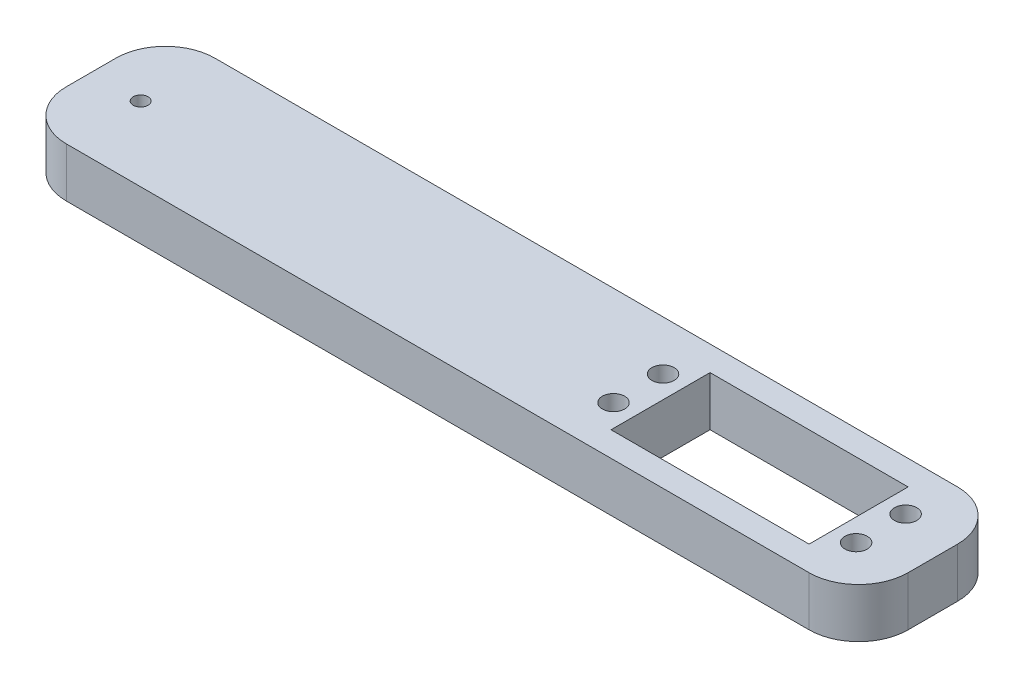
ISO-10303-21;
HEADER;
FILE_DESCRIPTION(('STEP AP214'),'2;1');
FILE_NAME('part.step','',(''),(''),'','','');
FILE_SCHEMA(('AUTOMOTIVE_DESIGN { 1 0 10303 214 1 1 1 1 }'));
ENDSEC;
DATA;
#1=APPLICATION_CONTEXT('core data for automotive mechanical design processes');
#2=APPLICATION_PROTOCOL_DEFINITION('international standard','automotive_design',2000,#1);
#3=PRODUCT_CONTEXT('',#1,'mechanical');
#4=PRODUCT('Part','Part','',(#3));
#5=PRODUCT_RELATED_PRODUCT_CATEGORY('part','',(#4));
#6=PRODUCT_DEFINITION_FORMATION('','',#4);
#7=PRODUCT_DEFINITION_CONTEXT('part definition',#1,'design');
#8=PRODUCT_DEFINITION('design','',#6,#7);
#9=PRODUCT_DEFINITION_SHAPE('','',#8);
#10=(LENGTH_UNIT() NAMED_UNIT(*) SI_UNIT(.MILLI.,.METRE.));
#11=(NAMED_UNIT(*) PLANE_ANGLE_UNIT() SI_UNIT($,.RADIAN.));
#12=(NAMED_UNIT(*) SI_UNIT($,.STERADIAN.) SOLID_ANGLE_UNIT());
#13=UNCERTAINTY_MEASURE_WITH_UNIT(LENGTH_MEASURE(1.E-05),#10,'distance_accuracy_value','');
#14=(GEOMETRIC_REPRESENTATION_CONTEXT(3) GLOBAL_UNCERTAINTY_ASSIGNED_CONTEXT((#13)) GLOBAL_UNIT_ASSIGNED_CONTEXT((#10,
#11,#12)) REPRESENTATION_CONTEXT('',''));
#15=CARTESIAN_POINT('',(0.,0.,0.));
#16=DIRECTION('',(0.,0.,1.));
#17=DIRECTION('',(1.,0.,0.));
#18=AXIS2_PLACEMENT_3D('',#15,#16,#17);
#19=CARTESIAN_POINT('',(0.,10.,0.));
#20=DIRECTION('',(0.,1.,0.));
#21=DIRECTION('',(0.,0.,1.));
#22=AXIS2_PLACEMENT_3D('',#19,#20,#21);
#23=PLANE('',#22);
#24=CARTESIAN_POINT('',(-75.,10.,0.));
#25=DIRECTION('',(0.,1.,0.));
#26=DIRECTION('',(0.,0.,1.));
#27=AXIS2_PLACEMENT_3D('',#24,#25,#26);
#28=CIRCLE('',#27,1.5);
#29=CARTESIAN_POINT('',(-75.,10.,1.49999999999998));
#30=VERTEX_POINT('',#29);
#31=EDGE_CURVE('E504',#30,#30,#28,.T.);
#32=ORIENTED_EDGE('',*,*,#31,.F.);
#33=EDGE_LOOP('',(#32));
#34=FACE_BOUND('',#33,.T.);
#35=CARTESIAN_POINT('',(74.5,10.,-5.));
#36=DIRECTION('',(0.,1.,0.));
#37=DIRECTION('',(0.,0.,-1.));
#38=AXIS2_PLACEMENT_3D('',#35,#36,#37);
#39=CIRCLE('',#38,2.25);
#40=CARTESIAN_POINT('',(74.5,10.,-7.25));
#41=VERTEX_POINT('',#40);
#42=EDGE_CURVE('E466',#41,#41,#39,.T.);
#43=ORIENTED_EDGE('',*,*,#42,.F.);
#44=EDGE_LOOP('',(#43));
#45=FACE_BOUND('',#44,.T.);
#46=CARTESIAN_POINT('',(25.5,10.,5.00000000000001));
#47=DIRECTION('',(0.,1.,0.));
#48=DIRECTION('',(0.,0.,-1.));
#49=AXIS2_PLACEMENT_3D('',#46,#47,#48);
#50=CIRCLE('',#49,2.25);
#51=CARTESIAN_POINT('',(25.5,10.,2.75000000000001));
#52=VERTEX_POINT('',#51);
#53=EDGE_CURVE('E475',#52,#52,#50,.T.);
#54=ORIENTED_EDGE('',*,*,#53,.F.);
#55=EDGE_LOOP('',(#54));
#56=FACE_BOUND('',#55,.T.);
#57=CARTESIAN_POINT('',(25.5,10.,-4.99999999999999));
#58=DIRECTION('',(0.,1.,0.));
#59=DIRECTION('',(0.,0.,1.));
#60=AXIS2_PLACEMENT_3D('',#57,#58,#59);
#61=CIRCLE('',#60,2.25);
#62=CARTESIAN_POINT('',(25.5,10.,-2.75));
#63=VERTEX_POINT('',#62);
#64=EDGE_CURVE('E496',#63,#63,#61,.T.);
#65=ORIENTED_EDGE('',*,*,#64,.F.);
#66=EDGE_LOOP('',(#65));
#67=FACE_BOUND('',#66,.T.);
#68=CARTESIAN_POINT('',(74.5,10.,5.));
#69=DIRECTION('',(0.,1.,0.));
#70=DIRECTION('',(0.,0.,1.));
#71=AXIS2_PLACEMENT_3D('',#68,#69,#70);
#72=CIRCLE('',#71,2.25);
#73=CARTESIAN_POINT('',(74.5,10.,7.25));
#74=VERTEX_POINT('',#73);
#75=EDGE_CURVE('E472',#74,#74,#72,.T.);
#76=ORIENTED_EDGE('',*,*,#75,.F.);
#77=EDGE_LOOP('',(#76));
#78=FACE_BOUND('',#77,.T.);
#79=DIRECTION('',(1.,0.,0.));
#80=VECTOR('',#79,1.);
#81=CARTESIAN_POINT('',(85.,10.,15.));
#82=LINE('',#81,#80);
#83=CARTESIAN_POINT('',(-75.,10.,15.));
#84=VERTEX_POINT('',#83);
#85=CARTESIAN_POINT('',(75.,10.,15.));
#86=VERTEX_POINT('',#85);
#87=EDGE_CURVE('E189',#84,#86,#82,.T.);
#88=ORIENTED_EDGE('',*,*,#87,.T.);
#89=CARTESIAN_POINT('',(75.,10.,4.99999999999999));
#90=DIRECTION('',(0.,1.,0.));
#91=DIRECTION('',(0.,0.,1.));
#92=AXIS2_PLACEMENT_3D('',#89,#90,#91);
#93=CIRCLE('',#92,10.);
#94=CARTESIAN_POINT('',(85.,10.,4.99999999999999));
#95=VERTEX_POINT('',#94);
#96=EDGE_CURVE('E247',#86,#95,#93,.T.);
#97=ORIENTED_EDGE('',*,*,#96,.T.);
#98=DIRECTION('',(0.,0.,-1.));
#99=VECTOR('',#98,1.);
#100=CARTESIAN_POINT('',(85.,10.,15.));
#101=LINE('',#100,#99);
#102=CARTESIAN_POINT('',(85.,10.,-5.00000000000001));
#103=VERTEX_POINT('',#102);
#104=EDGE_CURVE('E194',#95,#103,#101,.T.);
#105=ORIENTED_EDGE('',*,*,#104,.T.);
#106=CARTESIAN_POINT('',(75.,10.,-5.00000000000001));
#107=DIRECTION('',(0.,1.,0.));
#108=DIRECTION('',(0.,0.,1.));
#109=AXIS2_PLACEMENT_3D('',#106,#107,#108);
#110=CIRCLE('',#109,10.);
#111=CARTESIAN_POINT('',(75.,10.,-15.));
#112=VERTEX_POINT('',#111);
#113=EDGE_CURVE('E60',#103,#112,#110,.T.);
#114=ORIENTED_EDGE('',*,*,#113,.T.);
#115=DIRECTION('',(-1.,0.,0.));
#116=VECTOR('',#115,1.);
#117=CARTESIAN_POINT('',(85.,10.,-15.));
#118=LINE('',#117,#116);
#119=CARTESIAN_POINT('',(-75.,10.,-15.));
#120=VERTEX_POINT('',#119);
#121=EDGE_CURVE('E197',#112,#120,#118,.T.);
#122=ORIENTED_EDGE('',*,*,#121,.T.);
#123=CARTESIAN_POINT('',(-75.,10.,-4.99999999999999));
#124=DIRECTION('',(0.,1.,0.));
#125=DIRECTION('',(0.,0.,1.));
#126=AXIS2_PLACEMENT_3D('',#123,#124,#125);
#127=CIRCLE('',#126,10.);
#128=CARTESIAN_POINT('',(-85.,10.,-4.99999999999999));
#129=VERTEX_POINT('',#128);
#130=EDGE_CURVE('E241',#120,#129,#127,.T.);
#131=ORIENTED_EDGE('',*,*,#130,.T.);
#132=DIRECTION('',(0.,0.,1.));
#133=VECTOR('',#132,1.);
#134=CARTESIAN_POINT('',(-85.,10.,15.));
#135=LINE('',#134,#133);
#136=CARTESIAN_POINT('',(-85.,10.,5.00000000000001));
#137=VERTEX_POINT('',#136);
#138=EDGE_CURVE('E185',#129,#137,#135,.T.);
#139=ORIENTED_EDGE('',*,*,#138,.T.);
#140=CARTESIAN_POINT('',(-75.,10.,5.00000000000001));
#141=DIRECTION('',(0.,1.,0.));
#142=DIRECTION('',(0.,0.,1.));
#143=AXIS2_PLACEMENT_3D('',#140,#141,#142);
#144=CIRCLE('',#143,10.);
#145=EDGE_CURVE('E244',#137,#84,#144,.T.);
#146=ORIENTED_EDGE('',*,*,#145,.T.);
#147=EDGE_LOOP('',(#88,#97,#105,#114,#122,#131,#139,#146));
#148=FACE_BOUND('',#147,.T.);
#149=DIRECTION('',(1.,0.,0.));
#150=VECTOR('',#149,1.);
#151=CARTESIAN_POINT('',(30.,10.,10.));
#152=LINE('',#151,#150);
#153=CARTESIAN_POINT('',(30.,10.,10.));
#154=VERTEX_POINT('',#153);
#155=CARTESIAN_POINT('',(70.,10.,10.));
#156=VERTEX_POINT('',#155);
#157=EDGE_CURVE('E141',#154,#156,#152,.T.);
#158=ORIENTED_EDGE('',*,*,#157,.F.);
#159=DIRECTION('',(0.,0.,1.));
#160=VECTOR('',#159,1.);
#161=CARTESIAN_POINT('',(30.,10.,10.));
#162=LINE('',#161,#160);
#163=CARTESIAN_POINT('',(30.,10.,-10.));
#164=VERTEX_POINT('',#163);
#165=EDGE_CURVE('E130',#164,#154,#162,.T.);
#166=ORIENTED_EDGE('',*,*,#165,.F.);
#167=DIRECTION('',(-1.,0.,0.));
#168=VECTOR('',#167,1.);
#169=CARTESIAN_POINT('',(30.,10.,-10.));
#170=LINE('',#169,#168);
#171=CARTESIAN_POINT('',(70.,10.,-10.));
#172=VERTEX_POINT('',#171);
#173=EDGE_CURVE('E159',#172,#164,#170,.T.);
#174=ORIENTED_EDGE('',*,*,#173,.F.);
#175=DIRECTION('',(0.,0.,-1.));
#176=VECTOR('',#175,1.);
#177=CARTESIAN_POINT('',(70.,10.,10.));
#178=LINE('',#177,#176);
#179=EDGE_CURVE('E155',#156,#172,#178,.T.);
#180=ORIENTED_EDGE('',*,*,#179,.F.);
#181=EDGE_LOOP('',(#158,#166,#174,#180));
#182=FACE_BOUND('',#181,.T.);
#183=ADVANCED_FACE('F39',(#34,#45,#56,#67,#78,#148,#182),#23,.T.);
#184=CARTESIAN_POINT('',(0.,0.,0.));
#185=DIRECTION('',(0.,1.,0.));
#186=DIRECTION('',(0.,0.,1.));
#187=AXIS2_PLACEMENT_3D('',#184,#185,#186);
#188=PLANE('',#187);
#189=CARTESIAN_POINT('',(-75.,0.,0.));
#190=DIRECTION('',(0.,1.,0.));
#191=DIRECTION('',(0.,0.,1.));
#192=AXIS2_PLACEMENT_3D('',#189,#190,#191);
#193=CIRCLE('',#192,1.5);
#194=CARTESIAN_POINT('',(-75.,0.,1.49999999999998));
#195=VERTEX_POINT('',#194);
#196=EDGE_CURVE('E502',#195,#195,#193,.T.);
#197=ORIENTED_EDGE('',*,*,#196,.T.);
#198=EDGE_LOOP('',(#197));
#199=FACE_BOUND('',#198,.T.);
#200=CARTESIAN_POINT('',(74.5,0.,-5.));
#201=DIRECTION('',(0.,1.,0.));
#202=DIRECTION('',(0.,0.,-1.));
#203=AXIS2_PLACEMENT_3D('',#200,#201,#202);
#204=CIRCLE('',#203,2.25);
#205=CARTESIAN_POINT('',(74.5,0.,-7.25));
#206=VERTEX_POINT('',#205);
#207=EDGE_CURVE('E463',#206,#206,#204,.T.);
#208=ORIENTED_EDGE('',*,*,#207,.T.);
#209=EDGE_LOOP('',(#208));
#210=FACE_BOUND('',#209,.T.);
#211=CARTESIAN_POINT('',(25.5,0.,5.00000000000001));
#212=DIRECTION('',(0.,1.,0.));
#213=DIRECTION('',(0.,0.,-1.));
#214=AXIS2_PLACEMENT_3D('',#211,#212,#213);
#215=CIRCLE('',#214,2.25);
#216=CARTESIAN_POINT('',(25.5,0.,2.75000000000001));
#217=VERTEX_POINT('',#216);
#218=EDGE_CURVE('E468',#217,#217,#215,.T.);
#219=ORIENTED_EDGE('',*,*,#218,.T.);
#220=EDGE_LOOP('',(#219));
#221=FACE_BOUND('',#220,.T.);
#222=CARTESIAN_POINT('',(25.5,0.,-4.99999999999999));
#223=DIRECTION('',(0.,1.,0.));
#224=DIRECTION('',(0.,0.,1.));
#225=AXIS2_PLACEMENT_3D('',#222,#223,#224);
#226=CIRCLE('',#225,2.25);
#227=CARTESIAN_POINT('',(25.5,0.,-2.75));
#228=VERTEX_POINT('',#227);
#229=EDGE_CURVE('E482',#228,#228,#226,.T.);
#230=ORIENTED_EDGE('',*,*,#229,.T.);
#231=EDGE_LOOP('',(#230));
#232=FACE_BOUND('',#231,.T.);
#233=CARTESIAN_POINT('',(74.5,0.,5.));
#234=DIRECTION('',(0.,1.,0.));
#235=DIRECTION('',(0.,0.,1.));
#236=AXIS2_PLACEMENT_3D('',#233,#234,#235);
#237=CIRCLE('',#236,2.25);
#238=CARTESIAN_POINT('',(74.5,0.,7.25));
#239=VERTEX_POINT('',#238);
#240=EDGE_CURVE('E168',#239,#239,#237,.T.);
#241=ORIENTED_EDGE('',*,*,#240,.T.);
#242=EDGE_LOOP('',(#241));
#243=FACE_BOUND('',#242,.T.);
#244=DIRECTION('',(0.,0.,-1.));
#245=VECTOR('',#244,1.);
#246=CARTESIAN_POINT('',(85.,0.,15.));
#247=LINE('',#246,#245);
#248=CARTESIAN_POINT('',(85.,0.,4.99999999999999));
#249=VERTEX_POINT('',#248);
#250=CARTESIAN_POINT('',(85.,0.,-5.00000000000001));
#251=VERTEX_POINT('',#250);
#252=EDGE_CURVE('E208',#249,#251,#247,.T.);
#253=ORIENTED_EDGE('',*,*,#252,.F.);
#254=CARTESIAN_POINT('',(75.,0.,4.99999999999999));
#255=DIRECTION('',(0.,1.,0.));
#256=DIRECTION('',(0.,0.,1.));
#257=AXIS2_PLACEMENT_3D('',#254,#255,#256);
#258=CIRCLE('',#257,10.);
#259=CARTESIAN_POINT('',(75.,0.,15.));
#260=VERTEX_POINT('',#259);
#261=EDGE_CURVE('E229',#249,#260,#258,.F.);
#262=ORIENTED_EDGE('',*,*,#261,.T.);
#263=DIRECTION('',(1.,0.,0.));
#264=VECTOR('',#263,1.);
#265=CARTESIAN_POINT('',(85.,0.,15.));
#266=LINE('',#265,#264);
#267=CARTESIAN_POINT('',(-75.,0.,15.));
#268=VERTEX_POINT('',#267);
#269=EDGE_CURVE('E204',#268,#260,#266,.T.);
#270=ORIENTED_EDGE('',*,*,#269,.F.);
#271=CARTESIAN_POINT('',(-75.,0.,5.00000000000001));
#272=DIRECTION('',(0.,1.,0.));
#273=DIRECTION('',(0.,0.,1.));
#274=AXIS2_PLACEMENT_3D('',#271,#272,#273);
#275=CIRCLE('',#274,10.);
#276=CARTESIAN_POINT('',(-85.,0.,5.00000000000001));
#277=VERTEX_POINT('',#276);
#278=EDGE_CURVE('E226',#268,#277,#275,.F.);
#279=ORIENTED_EDGE('',*,*,#278,.T.);
#280=DIRECTION('',(0.,0.,1.));
#281=VECTOR('',#280,1.);
#282=CARTESIAN_POINT('',(-85.,0.,15.));
#283=LINE('',#282,#281);
#284=CARTESIAN_POINT('',(-85.,0.,-4.99999999999999));
#285=VERTEX_POINT('',#284);
#286=EDGE_CURVE('E150',#285,#277,#283,.T.);
#287=ORIENTED_EDGE('',*,*,#286,.F.);
#288=CARTESIAN_POINT('',(-75.,0.,-4.99999999999999));
#289=DIRECTION('',(0.,1.,0.));
#290=DIRECTION('',(0.,0.,1.));
#291=AXIS2_PLACEMENT_3D('',#288,#289,#290);
#292=CIRCLE('',#291,10.);
#293=CARTESIAN_POINT('',(-75.,0.,-15.));
#294=VERTEX_POINT('',#293);
#295=EDGE_CURVE('E223',#285,#294,#292,.F.);
#296=ORIENTED_EDGE('',*,*,#295,.T.);
#297=DIRECTION('',(-1.,0.,0.));
#298=VECTOR('',#297,1.);
#299=CARTESIAN_POINT('',(85.,0.,-15.));
#300=LINE('',#299,#298);
#301=CARTESIAN_POINT('',(75.,0.,-15.));
#302=VERTEX_POINT('',#301);
#303=EDGE_CURVE('E190',#302,#294,#300,.T.);
#304=ORIENTED_EDGE('',*,*,#303,.F.);
#305=CARTESIAN_POINT('',(75.,0.,-5.00000000000001));
#306=DIRECTION('',(0.,1.,0.));
#307=DIRECTION('',(0.,0.,1.));
#308=AXIS2_PLACEMENT_3D('',#305,#306,#307);
#309=CIRCLE('',#308,10.);
#310=EDGE_CURVE('E220',#302,#251,#309,.F.);
#311=ORIENTED_EDGE('',*,*,#310,.T.);
#312=EDGE_LOOP('',(#253,#262,#270,#279,#287,#296,#304,#311));
#313=FACE_BOUND('',#312,.T.);
#314=DIRECTION('',(0.,0.,1.));
#315=VECTOR('',#314,1.);
#316=CARTESIAN_POINT('',(30.,0.,10.));
#317=LINE('',#316,#315);
#318=CARTESIAN_POINT('',(30.,0.,-10.));
#319=VERTEX_POINT('',#318);
#320=CARTESIAN_POINT('',(30.,0.,10.));
#321=VERTEX_POINT('',#320);
#322=EDGE_CURVE('E165',#319,#321,#317,.T.);
#323=ORIENTED_EDGE('',*,*,#322,.T.);
#324=DIRECTION('',(1.,0.,0.));
#325=VECTOR('',#324,1.);
#326=CARTESIAN_POINT('',(30.,0.,10.));
#327=LINE('',#326,#325);
#328=CARTESIAN_POINT('',(70.,0.,10.));
#329=VERTEX_POINT('',#328);
#330=EDGE_CURVE('E148',#321,#329,#327,.T.);
#331=ORIENTED_EDGE('',*,*,#330,.T.);
#332=DIRECTION('',(0.,0.,-1.));
#333=VECTOR('',#332,1.);
#334=CARTESIAN_POINT('',(70.,0.,10.));
#335=LINE('',#334,#333);
#336=CARTESIAN_POINT('',(70.,0.,-10.));
#337=VERTEX_POINT('',#336);
#338=EDGE_CURVE('E171',#329,#337,#335,.T.);
#339=ORIENTED_EDGE('',*,*,#338,.T.);
#340=DIRECTION('',(-1.,0.,0.));
#341=VECTOR('',#340,1.);
#342=CARTESIAN_POINT('',(30.,0.,-10.));
#343=LINE('',#342,#341);
#344=EDGE_CURVE('E142',#337,#319,#343,.T.);
#345=ORIENTED_EDGE('',*,*,#344,.T.);
#346=EDGE_LOOP('',(#323,#331,#339,#345));
#347=FACE_BOUND('',#346,.T.);
#348=ADVANCED_FACE('F264',(#199,#210,#221,#232,#243,#313,#347),#188,.F.);
#349=CARTESIAN_POINT('',(-85.,10.,15.));
#350=DIRECTION('',(1.,0.,0.));
#351=DIRECTION('',(0.,0.,-1.));
#352=AXIS2_PLACEMENT_3D('',#349,#350,#351);
#353=PLANE('',#352);
#354=ORIENTED_EDGE('',*,*,#286,.T.);
#355=DIRECTION('',(0.,-1.,0.));
#356=VECTOR('',#355,1.);
#357=CARTESIAN_POINT('',(-85.,10.,5.00000000000001));
#358=LINE('',#357,#356);
#359=EDGE_CURVE('E254',#277,#137,#358,.F.);
#360=ORIENTED_EDGE('',*,*,#359,.T.);
#361=ORIENTED_EDGE('',*,*,#138,.F.);
#362=DIRECTION('',(0.,-1.,0.));
#363=VECTOR('',#362,1.);
#364=CARTESIAN_POINT('',(-85.,10.,-4.99999999999999));
#365=LINE('',#364,#363);
#366=EDGE_CURVE('E250',#129,#285,#365,.T.);
#367=ORIENTED_EDGE('',*,*,#366,.T.);
#368=EDGE_LOOP('',(#354,#360,#361,#367));
#369=FACE_BOUND('',#368,.T.);
#370=ADVANCED_FACE('F273',(#369),#353,.F.);
#371=CARTESIAN_POINT('',(85.,10.,15.));
#372=DIRECTION('',(0.,0.,-1.));
#373=DIRECTION('',(-1.,0.,0.));
#374=AXIS2_PLACEMENT_3D('',#371,#372,#373);
#375=PLANE('',#374);
#376=ORIENTED_EDGE('',*,*,#269,.T.);
#377=DIRECTION('',(0.,-1.,0.));
#378=VECTOR('',#377,1.);
#379=CARTESIAN_POINT('',(75.,10.,15.));
#380=LINE('',#379,#378);
#381=EDGE_CURVE('E236',#260,#86,#380,.F.);
#382=ORIENTED_EDGE('',*,*,#381,.T.);
#383=ORIENTED_EDGE('',*,*,#87,.F.);
#384=DIRECTION('',(0.,-1.,0.));
#385=VECTOR('',#384,1.);
#386=CARTESIAN_POINT('',(-75.,10.,15.));
#387=LINE('',#386,#385);
#388=EDGE_CURVE('E232',#84,#268,#387,.T.);
#389=ORIENTED_EDGE('',*,*,#388,.T.);
#390=EDGE_LOOP('',(#376,#382,#383,#389));
#391=FACE_BOUND('',#390,.T.);
#392=ADVANCED_FACE('F282',(#391),#375,.F.);
#393=CARTESIAN_POINT('',(85.,10.,15.));
#394=DIRECTION('',(-1.,0.,0.));
#395=DIRECTION('',(0.,0.,1.));
#396=AXIS2_PLACEMENT_3D('',#393,#394,#395);
#397=PLANE('',#396);
#398=ORIENTED_EDGE('',*,*,#104,.F.);
#399=DIRECTION('',(0.,-1.,0.));
#400=VECTOR('',#399,1.);
#401=CARTESIAN_POINT('',(85.,10.,4.99999999999999));
#402=LINE('',#401,#400);
#403=EDGE_CURVE('E216',#95,#249,#402,.T.);
#404=ORIENTED_EDGE('',*,*,#403,.T.);
#405=ORIENTED_EDGE('',*,*,#252,.T.);
#406=DIRECTION('',(0.,-1.,0.));
#407=VECTOR('',#406,1.);
#408=CARTESIAN_POINT('',(85.,10.,-5.00000000000001));
#409=LINE('',#408,#407);
#410=EDGE_CURVE('E200',#251,#103,#409,.F.);
#411=ORIENTED_EDGE('',*,*,#410,.T.);
#412=EDGE_LOOP('',(#398,#404,#405,#411));
#413=FACE_BOUND('',#412,.T.);
#414=ADVANCED_FACE('F290',(#413),#397,.F.);
#415=CARTESIAN_POINT('',(85.,10.,-15.));
#416=DIRECTION('',(0.,0.,1.));
#417=DIRECTION('',(1.,0.,0.));
#418=AXIS2_PLACEMENT_3D('',#415,#416,#417);
#419=PLANE('',#418);
#420=ORIENTED_EDGE('',*,*,#303,.T.);
#421=DIRECTION('',(0.,-1.,0.));
#422=VECTOR('',#421,1.);
#423=CARTESIAN_POINT('',(-75.,10.,-15.));
#424=LINE('',#423,#422);
#425=EDGE_CURVE('E11',#294,#120,#424,.F.);
#426=ORIENTED_EDGE('',*,*,#425,.T.);
#427=ORIENTED_EDGE('',*,*,#121,.F.);
#428=DIRECTION('',(0.,-1.,0.));
#429=VECTOR('',#428,1.);
#430=CARTESIAN_POINT('',(75.,10.,-15.));
#431=LINE('',#430,#429);
#432=EDGE_CURVE('E48',#112,#302,#431,.T.);
#433=ORIENTED_EDGE('',*,*,#432,.T.);
#434=EDGE_LOOP('',(#420,#426,#427,#433));
#435=FACE_BOUND('',#434,.T.);
#436=ADVANCED_FACE('F260',(#435),#419,.F.);
#437=CARTESIAN_POINT('',(30.,10.,10.));
#438=DIRECTION('',(1.,0.,0.));
#439=DIRECTION('',(0.,0.,-1.));
#440=AXIS2_PLACEMENT_3D('',#437,#438,#439);
#441=PLANE('',#440);
#442=ORIENTED_EDGE('',*,*,#322,.F.);
#443=DIRECTION('',(0.,-1.,0.));
#444=VECTOR('',#443,1.);
#445=CARTESIAN_POINT('',(30.,10.,-10.));
#446=LINE('',#445,#444);
#447=EDGE_CURVE('E136',#164,#319,#446,.T.);
#448=ORIENTED_EDGE('',*,*,#447,.F.);
#449=ORIENTED_EDGE('',*,*,#165,.T.);
#450=DIRECTION('',(0.,-1.,0.));
#451=VECTOR('',#450,1.);
#452=CARTESIAN_POINT('',(30.,10.,10.));
#453=LINE('',#452,#451);
#454=EDGE_CURVE('E133',#154,#321,#453,.T.);
#455=ORIENTED_EDGE('',*,*,#454,.T.);
#456=EDGE_LOOP('',(#442,#448,#449,#455));
#457=FACE_BOUND('',#456,.T.);
#458=ADVANCED_FACE('F132',(#457),#441,.T.);
#459=CARTESIAN_POINT('',(30.,10.,10.));
#460=DIRECTION('',(0.,0.,-1.));
#461=DIRECTION('',(-1.,0.,0.));
#462=AXIS2_PLACEMENT_3D('',#459,#460,#461);
#463=PLANE('',#462);
#464=ORIENTED_EDGE('',*,*,#330,.F.);
#465=ORIENTED_EDGE('',*,*,#454,.F.);
#466=ORIENTED_EDGE('',*,*,#157,.T.);
#467=DIRECTION('',(0.,-1.,0.));
#468=VECTOR('',#467,1.);
#469=CARTESIAN_POINT('',(70.,10.,10.));
#470=LINE('',#469,#468);
#471=EDGE_CURVE('E151',#156,#329,#470,.T.);
#472=ORIENTED_EDGE('',*,*,#471,.T.);
#473=EDGE_LOOP('',(#464,#465,#466,#472));
#474=FACE_BOUND('',#473,.T.);
#475=ADVANCED_FACE('F145',(#474),#463,.T.);
#476=CARTESIAN_POINT('',(70.,10.,10.));
#477=DIRECTION('',(-1.,0.,0.));
#478=DIRECTION('',(0.,0.,1.));
#479=AXIS2_PLACEMENT_3D('',#476,#477,#478);
#480=PLANE('',#479);
#481=ORIENTED_EDGE('',*,*,#338,.F.);
#482=ORIENTED_EDGE('',*,*,#471,.F.);
#483=ORIENTED_EDGE('',*,*,#179,.T.);
#484=DIRECTION('',(0.,-1.,0.));
#485=VECTOR('',#484,1.);
#486=CARTESIAN_POINT('',(70.,10.,-10.));
#487=LINE('',#486,#485);
#488=EDGE_CURVE('E180',#172,#337,#487,.T.);
#489=ORIENTED_EDGE('',*,*,#488,.T.);
#490=EDGE_LOOP('',(#481,#482,#483,#489));
#491=FACE_BOUND('',#490,.T.);
#492=ADVANCED_FACE('F384',(#491),#480,.T.);
#493=CARTESIAN_POINT('',(30.,10.,-10.));
#494=DIRECTION('',(0.,0.,1.));
#495=DIRECTION('',(1.,0.,0.));
#496=AXIS2_PLACEMENT_3D('',#493,#494,#495);
#497=PLANE('',#496);
#498=ORIENTED_EDGE('',*,*,#344,.F.);
#499=ORIENTED_EDGE('',*,*,#488,.F.);
#500=ORIENTED_EDGE('',*,*,#173,.T.);
#501=ORIENTED_EDGE('',*,*,#447,.T.);
#502=EDGE_LOOP('',(#498,#499,#500,#501));
#503=FACE_BOUND('',#502,.T.);
#504=ADVANCED_FACE('F390',(#503),#497,.T.);
#505=CARTESIAN_POINT('',(74.5,0.,5.));
#506=DIRECTION('',(0.,1.,0.));
#507=DIRECTION('',(0.,0.,1.));
#508=AXIS2_PLACEMENT_3D('',#505,#506,#507);
#509=CYLINDRICAL_SURFACE('',#508,2.25);
#510=ORIENTED_EDGE('',*,*,#240,.F.);
#511=EDGE_LOOP('',(#510));
#512=FACE_BOUND('',#511,.T.);
#513=ORIENTED_EDGE('',*,*,#75,.T.);
#514=EDGE_LOOP('',(#513));
#515=FACE_BOUND('',#514,.T.);
#516=ADVANCED_FACE('F398',(#512,#515),#509,.F.);
#517=CARTESIAN_POINT('',(25.5,0.,-4.99999999999999));
#518=DIRECTION('',(0.,1.,0.));
#519=DIRECTION('',(0.,0.,1.));
#520=AXIS2_PLACEMENT_3D('',#517,#518,#519);
#521=CYLINDRICAL_SURFACE('',#520,2.25);
#522=ORIENTED_EDGE('',*,*,#229,.F.);
#523=EDGE_LOOP('',(#522));
#524=FACE_BOUND('',#523,.T.);
#525=ORIENTED_EDGE('',*,*,#64,.T.);
#526=EDGE_LOOP('',(#525));
#527=FACE_BOUND('',#526,.T.);
#528=ADVANCED_FACE('F406',(#524,#527),#521,.F.);
#529=CARTESIAN_POINT('',(25.5,0.,5.00000000000001));
#530=DIRECTION('',(0.,1.,0.));
#531=DIRECTION('',(0.,0.,1.));
#532=AXIS2_PLACEMENT_3D('',#529,#530,#531);
#533=CYLINDRICAL_SURFACE('',#532,2.25);
#534=ORIENTED_EDGE('',*,*,#218,.F.);
#535=EDGE_LOOP('',(#534));
#536=FACE_BOUND('',#535,.T.);
#537=ORIENTED_EDGE('',*,*,#53,.T.);
#538=EDGE_LOOP('',(#537));
#539=FACE_BOUND('',#538,.T.);
#540=ADVANCED_FACE('F414',(#536,#539),#533,.F.);
#541=CARTESIAN_POINT('',(74.5,0.,-5.));
#542=DIRECTION('',(0.,1.,0.));
#543=DIRECTION('',(0.,0.,1.));
#544=AXIS2_PLACEMENT_3D('',#541,#542,#543);
#545=CYLINDRICAL_SURFACE('',#544,2.25);
#546=ORIENTED_EDGE('',*,*,#207,.F.);
#547=EDGE_LOOP('',(#546));
#548=FACE_BOUND('',#547,.T.);
#549=ORIENTED_EDGE('',*,*,#42,.T.);
#550=EDGE_LOOP('',(#549));
#551=FACE_BOUND('',#550,.T.);
#552=ADVANCED_FACE('F323',(#548,#551),#545,.F.);
#553=CARTESIAN_POINT('',(75.,10.,4.99999999999999));
#554=DIRECTION('',(0.,-1.,0.));
#555=DIRECTION('',(0.,0.,-1.));
#556=AXIS2_PLACEMENT_3D('',#553,#554,#555);
#557=CYLINDRICAL_SURFACE('',#556,10.);
#558=ORIENTED_EDGE('',*,*,#96,.F.);
#559=ORIENTED_EDGE('',*,*,#381,.F.);
#560=ORIENTED_EDGE('',*,*,#261,.F.);
#561=ORIENTED_EDGE('',*,*,#403,.F.);
#562=EDGE_LOOP('',(#558,#559,#560,#561));
#563=FACE_BOUND('',#562,.T.);
#564=ADVANCED_FACE('F287',(#563),#557,.T.);
#565=CARTESIAN_POINT('',(-75.,10.,5.00000000000001));
#566=DIRECTION('',(0.,-1.,0.));
#567=DIRECTION('',(0.,0.,-1.));
#568=AXIS2_PLACEMENT_3D('',#565,#566,#567);
#569=CYLINDRICAL_SURFACE('',#568,10.);
#570=ORIENTED_EDGE('',*,*,#145,.F.);
#571=ORIENTED_EDGE('',*,*,#359,.F.);
#572=ORIENTED_EDGE('',*,*,#278,.F.);
#573=ORIENTED_EDGE('',*,*,#388,.F.);
#574=EDGE_LOOP('',(#570,#571,#572,#573));
#575=FACE_BOUND('',#574,.T.);
#576=ADVANCED_FACE('F279',(#575),#569,.T.);
#577=CARTESIAN_POINT('',(-75.,10.,-4.99999999999999));
#578=DIRECTION('',(0.,-1.,0.));
#579=DIRECTION('',(0.,0.,-1.));
#580=AXIS2_PLACEMENT_3D('',#577,#578,#579);
#581=CYLINDRICAL_SURFACE('',#580,10.);
#582=ORIENTED_EDGE('',*,*,#130,.F.);
#583=ORIENTED_EDGE('',*,*,#425,.F.);
#584=ORIENTED_EDGE('',*,*,#295,.F.);
#585=ORIENTED_EDGE('',*,*,#366,.F.);
#586=EDGE_LOOP('',(#582,#583,#584,#585));
#587=FACE_BOUND('',#586,.T.);
#588=ADVANCED_FACE('F270',(#587),#581,.T.);
#589=CARTESIAN_POINT('',(75.,10.,-5.00000000000001));
#590=DIRECTION('',(0.,-1.,0.));
#591=DIRECTION('',(0.,0.,-1.));
#592=AXIS2_PLACEMENT_3D('',#589,#590,#591);
#593=CYLINDRICAL_SURFACE('',#592,10.);
#594=ORIENTED_EDGE('',*,*,#113,.F.);
#595=ORIENTED_EDGE('',*,*,#410,.F.);
#596=ORIENTED_EDGE('',*,*,#310,.F.);
#597=ORIENTED_EDGE('',*,*,#432,.F.);
#598=EDGE_LOOP('',(#594,#595,#596,#597));
#599=FACE_BOUND('',#598,.T.);
#600=ADVANCED_FACE('F41',(#599),#593,.T.);
#601=CARTESIAN_POINT('',(-75.,0.,0.));
#602=DIRECTION('',(0.,1.,0.));
#603=DIRECTION('',(0.,0.,1.));
#604=AXIS2_PLACEMENT_3D('',#601,#602,#603);
#605=CYLINDRICAL_SURFACE('',#604,1.5);
#606=ORIENTED_EDGE('',*,*,#196,.F.);
#607=EDGE_LOOP('',(#606));
#608=FACE_BOUND('',#607,.T.);
#609=ORIENTED_EDGE('',*,*,#31,.T.);
#610=EDGE_LOOP('',(#609));
#611=FACE_BOUND('',#610,.T.);
#612=ADVANCED_FACE('F293',(#608,#611),#605,.F.);
#613=CLOSED_SHELL('',(#183,#348,#370,#392,#414,#436,#458,#475,#492,#504,#516,#528,#540,#552,
#564,#576,#588,#600,#612));
#614=MANIFOLD_SOLID_BREP('B2',#613);
#615=ADVANCED_BREP_SHAPE_REPRESENTATION('',(#18,#614),#14);
#616=SHAPE_DEFINITION_REPRESENTATION(#9,#615);
ENDSEC;
END-ISO-10303-21;
